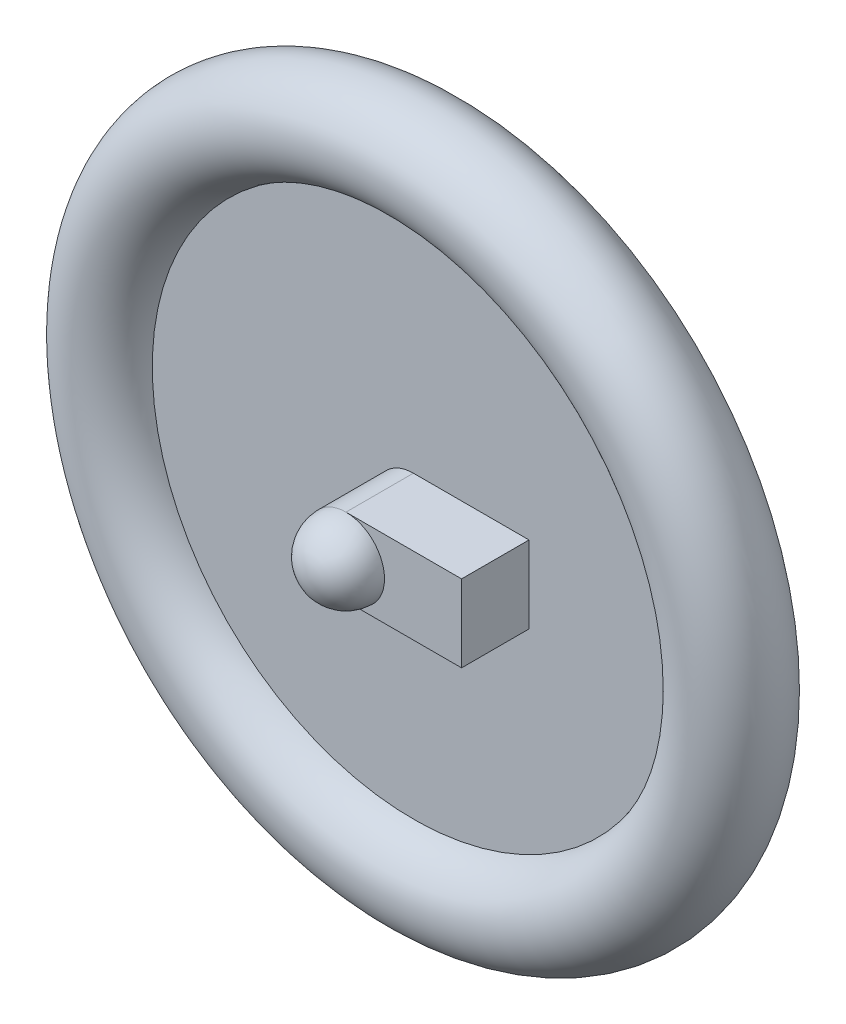
ISO-10303-21;
HEADER;
FILE_DESCRIPTION(('STEP AP214'),'2;1');
FILE_NAME('part.step','',(''),(''),'','','');
FILE_SCHEMA(('AUTOMOTIVE_DESIGN { 1 0 10303 214 1 1 1 1 }'));
ENDSEC;
DATA;
#1=APPLICATION_CONTEXT('core data for automotive mechanical design processes');
#2=APPLICATION_PROTOCOL_DEFINITION('international standard','automotive_design',2000,#1);
#3=PRODUCT_CONTEXT('',#1,'mechanical');
#4=PRODUCT('Part','Part','',(#3));
#5=PRODUCT_RELATED_PRODUCT_CATEGORY('part','',(#4));
#6=PRODUCT_DEFINITION_FORMATION('','',#4);
#7=PRODUCT_DEFINITION_CONTEXT('part definition',#1,'design');
#8=PRODUCT_DEFINITION('design','',#6,#7);
#9=PRODUCT_DEFINITION_SHAPE('','',#8);
#10=(LENGTH_UNIT() NAMED_UNIT(*) SI_UNIT(.MILLI.,.METRE.));
#11=(NAMED_UNIT(*) PLANE_ANGLE_UNIT() SI_UNIT($,.RADIAN.));
#12=(NAMED_UNIT(*) SI_UNIT($,.STERADIAN.) SOLID_ANGLE_UNIT());
#13=UNCERTAINTY_MEASURE_WITH_UNIT(LENGTH_MEASURE(1.E-05),#10,'distance_accuracy_value','');
#14=(GEOMETRIC_REPRESENTATION_CONTEXT(3) GLOBAL_UNCERTAINTY_ASSIGNED_CONTEXT((#13)) GLOBAL_UNIT_ASSIGNED_CONTEXT((#10,
#11,#12)) REPRESENTATION_CONTEXT('',''));
#15=CARTESIAN_POINT('',(0.,0.,0.));
#16=DIRECTION('',(0.,0.,1.));
#17=DIRECTION('',(1.,0.,0.));
#18=AXIS2_PLACEMENT_3D('',#15,#16,#17);
#19=CARTESIAN_POINT('',(-80.,92.501,2.5));
#20=DIRECTION('',(0.,0.,-1.));
#21=DIRECTION('',(-1.,0.,0.));
#22=AXIS2_PLACEMENT_3D('',#19,#20,#21);
#23=PLANE('',#22);
#24=CARTESIAN_POINT('',(0.,0.,2.49999999999999));
#25=DIRECTION('',(0.,0.,1.));
#26=DIRECTION('',(1.,0.,0.));
#27=AXIS2_PLACEMENT_3D('',#24,#25,#26);
#28=CIRCLE('',#27,67.7525512860841);
#29=CARTESIAN_POINT('',(67.7525512860841,0.,2.49999999999999));
#30=VERTEX_POINT('',#29);
#31=EDGE_CURVE('E51',#30,#30,#28,.F.);
#32=ORIENTED_EDGE('',*,*,#31,.F.);
#33=EDGE_LOOP('',(#32));
#34=FACE_BOUND('',#33,.T.);
#35=DIRECTION('',(-1.,0.,0.));
#36=VECTOR('',#35,1.);
#37=CARTESIAN_POINT('',(30.,-10.,2.5));
#38=LINE('',#37,#36);
#39=CARTESIAN_POINT('',(30.,-10.,2.5));
#40=VERTEX_POINT('',#39);
#41=CARTESIAN_POINT('',(0.,-10.,2.5));
#42=VERTEX_POINT('',#41);
#43=EDGE_CURVE('E98',#40,#42,#38,.T.);
#44=ORIENTED_EDGE('',*,*,#43,.T.);
#45=CARTESIAN_POINT('',(0.,0.,2.5));
#46=DIRECTION('',(0.,0.,-1.));
#47=DIRECTION('',(-1.,0.,0.));
#48=AXIS2_PLACEMENT_3D('',#45,#46,#47);
#49=CIRCLE('',#48,10.);
#50=CARTESIAN_POINT('',(0.,10.,2.5));
#51=VERTEX_POINT('',#50);
#52=EDGE_CURVE('E45',#42,#51,#49,.T.);
#53=ORIENTED_EDGE('',*,*,#52,.T.);
#54=DIRECTION('',(-1.,0.,0.));
#55=VECTOR('',#54,1.);
#56=CARTESIAN_POINT('',(30.,10.,2.5));
#57=LINE('',#56,#55);
#58=CARTESIAN_POINT('',(30.,10.,2.5));
#59=VERTEX_POINT('',#58);
#60=EDGE_CURVE('E81',#59,#51,#57,.T.);
#61=ORIENTED_EDGE('',*,*,#60,.F.);
#62=DIRECTION('',(0.,1.,0.));
#63=VECTOR('',#62,1.);
#64=CARTESIAN_POINT('',(30.,-10.,2.5));
#65=LINE('',#64,#63);
#66=EDGE_CURVE('E92',#40,#59,#65,.T.);
#67=ORIENTED_EDGE('',*,*,#66,.F.);
#68=EDGE_LOOP('',(#44,#53,#61,#67));
#69=FACE_BOUND('',#68,.T.);
#70=ADVANCED_FACE('F41',(#34,#69),#23,.F.);
#71=CARTESIAN_POINT('',(0.,0.,0.));
#72=DIRECTION('',(0.,0.,1.));
#73=DIRECTION('',(1.,0.,0.));
#74=AXIS2_PLACEMENT_3D('',#71,#72,#73);
#75=TOROIDAL_SURFACE('',#74,80.,12.5);
#76=ORIENTED_EDGE('',*,*,#31,.T.);
#77=EDGE_LOOP('',(#76));
#78=FACE_BOUND('',#77,.T.);
#79=CARTESIAN_POINT('',(0.,0.,-2.5));
#80=DIRECTION('',(0.,0.,-1.));
#81=DIRECTION('',(-1.,0.,0.));
#82=AXIS2_PLACEMENT_3D('',#79,#80,#81);
#83=CIRCLE('',#82,67.7525512860841);
#84=CARTESIAN_POINT('',(-67.7525512860841,0.,-2.5));
#85=VERTEX_POINT('',#84);
#86=EDGE_CURVE('E11',#85,#85,#83,.F.);
#87=ORIENTED_EDGE('',*,*,#86,.T.);
#88=EDGE_LOOP('',(#87));
#89=FACE_BOUND('',#88,.T.);
#90=ADVANCED_FACE('F43',(#78,#89),#75,.T.);
#91=CARTESIAN_POINT('',(-80.,92.501,-2.5));
#92=DIRECTION('',(0.,0.,1.));
#93=DIRECTION('',(1.,0.,0.));
#94=AXIS2_PLACEMENT_3D('',#91,#92,#93);
#95=PLANE('',#94);
#96=ORIENTED_EDGE('',*,*,#86,.F.);
#97=EDGE_LOOP('',(#96));
#98=FACE_BOUND('',#97,.T.);
#99=ADVANCED_FACE('F161',(#98),#95,.F.);
#100=CARTESIAN_POINT('',(0.,0.,30.));
#101=DIRECTION('',(0.,0.,1.));
#102=DIRECTION('',(1.,0.,0.));
#103=AXIS2_PLACEMENT_3D('',#100,#101,#102);
#104=CYLINDRICAL_SURFACE('',#103,10.);
#105=DIRECTION('',(0.,0.,-1.));
#106=VECTOR('',#105,1.);
#107=CARTESIAN_POINT('',(0.,-10.,20.));
#108=LINE('',#107,#106);
#109=CARTESIAN_POINT('',(0.,-10.,20.));
#110=VERTEX_POINT('',#109);
#111=EDGE_CURVE('E101',#110,#42,#108,.T.);
#112=ORIENTED_EDGE('',*,*,#111,.F.);
#113=CARTESIAN_POINT('',(0.,0.,20.));
#114=DIRECTION('',(0.,0.,1.));
#115=DIRECTION('',(1.,0.,0.));
#116=AXIS2_PLACEMENT_3D('',#113,#114,#115);
#117=CIRCLE('',#116,10.);
#118=CARTESIAN_POINT('',(0.,10.,20.));
#119=VERTEX_POINT('',#118);
#120=EDGE_CURVE('E126',#119,#110,#117,.T.);
#121=ORIENTED_EDGE('',*,*,#120,.F.);
#122=DIRECTION('',(0.,0.,1.));
#123=VECTOR('',#122,1.);
#124=CARTESIAN_POINT('',(0.,10.,20.));
#125=LINE('',#124,#123);
#126=EDGE_CURVE('E116',#51,#119,#125,.T.);
#127=ORIENTED_EDGE('',*,*,#126,.F.);
#128=ORIENTED_EDGE('',*,*,#52,.F.);
#129=EDGE_LOOP('',(#112,#121,#127,#128));
#130=FACE_BOUND('',#129,.T.);
#131=ADVANCED_FACE('F136',(#130),#104,.T.);
#132=CARTESIAN_POINT('',(0.,0.,20.));
#133=DIRECTION('',(0.,0.,1.));
#134=DIRECTION('',(1.,0.,0.));
#135=AXIS2_PLACEMENT_3D('',#132,#133,#134);
#136=SPHERICAL_SURFACE('',#135,10.);
#137=ORIENTED_EDGE('',*,*,#120,.T.);
#138=EDGE_CURVE('E125',#110,#119,#117,.T.);
#139=ORIENTED_EDGE('',*,*,#138,.T.);
#140=EDGE_LOOP('',(#137,#139));
#141=FACE_BOUND('',#140,.T.);
#142=ADVANCED_FACE('F141',(#141),#136,.T.);
#143=CARTESIAN_POINT('',(30.,-10.,20.));
#144=DIRECTION('',(0.,0.,-1.));
#145=DIRECTION('',(-1.,0.,0.));
#146=AXIS2_PLACEMENT_3D('',#143,#144,#145);
#147=PLANE('',#146);
#148=ORIENTED_EDGE('',*,*,#138,.F.);
#149=DIRECTION('',(-1.,0.,0.));
#150=VECTOR('',#149,1.);
#151=CARTESIAN_POINT('',(30.,-10.,20.));
#152=LINE('',#151,#150);
#153=CARTESIAN_POINT('',(30.,-10.,20.));
#154=VERTEX_POINT('',#153);
#155=EDGE_CURVE('E106',#154,#110,#152,.T.);
#156=ORIENTED_EDGE('',*,*,#155,.F.);
#157=DIRECTION('',(0.,-1.,0.));
#158=VECTOR('',#157,1.);
#159=CARTESIAN_POINT('',(30.,-10.,20.));
#160=LINE('',#159,#158);
#161=CARTESIAN_POINT('',(30.,10.,20.));
#162=VERTEX_POINT('',#161);
#163=EDGE_CURVE('E93',#162,#154,#160,.T.);
#164=ORIENTED_EDGE('',*,*,#163,.F.);
#165=DIRECTION('',(-1.,0.,0.));
#166=VECTOR('',#165,1.);
#167=CARTESIAN_POINT('',(30.,10.,20.));
#168=LINE('',#167,#166);
#169=EDGE_CURVE('E58',#162,#119,#168,.T.);
#170=ORIENTED_EDGE('',*,*,#169,.T.);
#171=EDGE_LOOP('',(#148,#156,#164,#170));
#172=FACE_BOUND('',#171,.T.);
#173=ADVANCED_FACE('F143',(#172),#147,.F.);
#174=CARTESIAN_POINT('',(30.,-10.,20.));
#175=DIRECTION('',(0.,1.,0.));
#176=DIRECTION('',(0.,0.,1.));
#177=AXIS2_PLACEMENT_3D('',#174,#175,#176);
#178=PLANE('',#177);
#179=ORIENTED_EDGE('',*,*,#111,.T.);
#180=ORIENTED_EDGE('',*,*,#43,.F.);
#181=DIRECTION('',(0.,0.,-1.));
#182=VECTOR('',#181,1.);
#183=CARTESIAN_POINT('',(30.,-10.,20.));
#184=LINE('',#183,#182);
#185=EDGE_CURVE('E89',#154,#40,#184,.T.);
#186=ORIENTED_EDGE('',*,*,#185,.F.);
#187=ORIENTED_EDGE('',*,*,#155,.T.);
#188=EDGE_LOOP('',(#179,#180,#186,#187));
#189=FACE_BOUND('',#188,.T.);
#190=ADVANCED_FACE('F99',(#189),#178,.F.);
#191=CARTESIAN_POINT('',(30.,10.,20.));
#192=DIRECTION('',(0.,-1.,0.));
#193=DIRECTION('',(0.,0.,-1.));
#194=AXIS2_PLACEMENT_3D('',#191,#192,#193);
#195=PLANE('',#194);
#196=ORIENTED_EDGE('',*,*,#126,.T.);
#197=ORIENTED_EDGE('',*,*,#169,.F.);
#198=DIRECTION('',(0.,0.,1.));
#199=VECTOR('',#198,1.);
#200=CARTESIAN_POINT('',(30.,10.,20.));
#201=LINE('',#200,#199);
#202=EDGE_CURVE('E67',#59,#162,#201,.T.);
#203=ORIENTED_EDGE('',*,*,#202,.F.);
#204=ORIENTED_EDGE('',*,*,#60,.T.);
#205=EDGE_LOOP('',(#196,#197,#203,#204));
#206=FACE_BOUND('',#205,.T.);
#207=ADVANCED_FACE('F139',(#206),#195,.F.);
#208=CARTESIAN_POINT('',(30.,0.,0.));
#209=DIRECTION('',(-1.,0.,0.));
#210=DIRECTION('',(0.,0.,1.));
#211=AXIS2_PLACEMENT_3D('',#208,#209,#210);
#212=PLANE('',#211);
#213=ORIENTED_EDGE('',*,*,#163,.T.);
#214=ORIENTED_EDGE('',*,*,#185,.T.);
#215=ORIENTED_EDGE('',*,*,#66,.T.);
#216=ORIENTED_EDGE('',*,*,#202,.T.);
#217=EDGE_LOOP('',(#213,#214,#215,#216));
#218=FACE_BOUND('',#217,.T.);
#219=ADVANCED_FACE('F90',(#218),#212,.F.);
#220=CLOSED_SHELL('',(#70,#90,#99,#131,#142,#173,#190,#207,#219));
#221=MANIFOLD_SOLID_BREP('B2',#220);
#222=ADVANCED_BREP_SHAPE_REPRESENTATION('',(#18,#221),#14);
#223=SHAPE_DEFINITION_REPRESENTATION(#9,#222);
ENDSEC;
END-ISO-10303-21;
